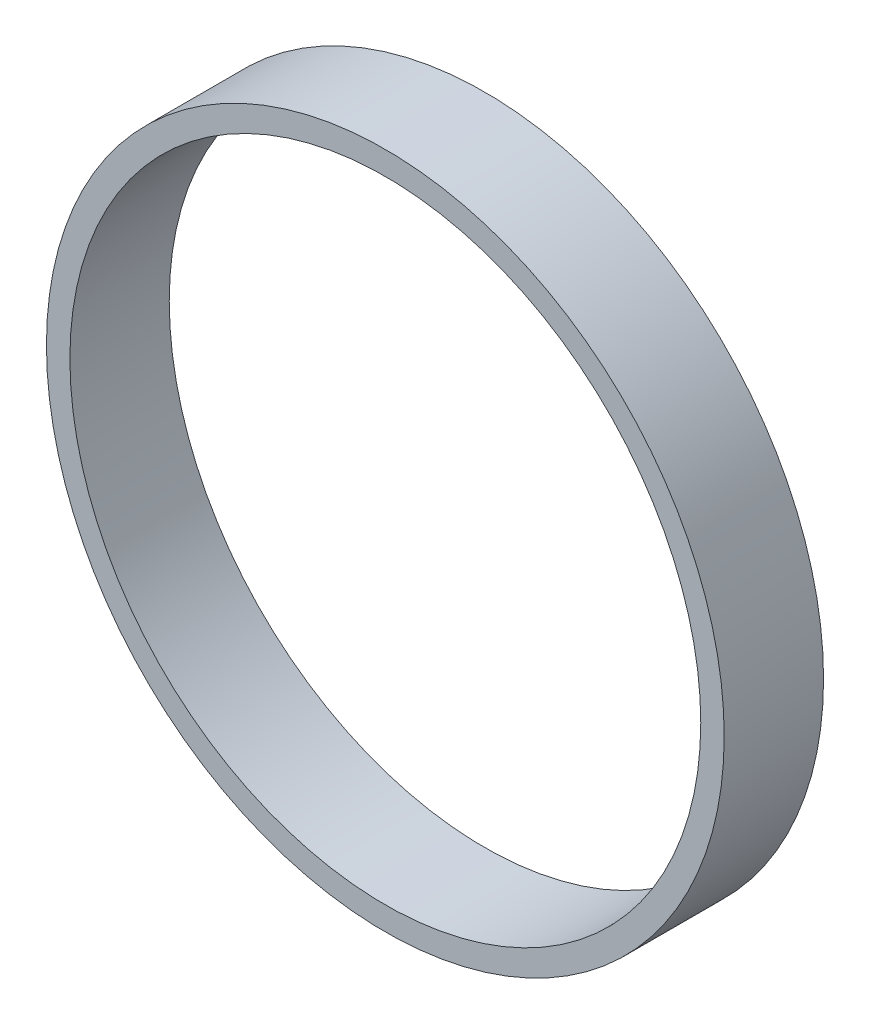
ISO-10303-21;
HEADER;
FILE_DESCRIPTION(('STEP AP214'),'2;1');
FILE_NAME('part.step','',(''),(''),'','','');
FILE_SCHEMA(('AUTOMOTIVE_DESIGN { 1 0 10303 214 1 1 1 1 }'));
ENDSEC;
DATA;
#1=APPLICATION_CONTEXT('core data for automotive mechanical design processes');
#2=APPLICATION_PROTOCOL_DEFINITION('international standard','automotive_design',2000,#1);
#3=PRODUCT_CONTEXT('',#1,'mechanical');
#4=PRODUCT('Part','Part','',(#3));
#5=PRODUCT_RELATED_PRODUCT_CATEGORY('part','',(#4));
#6=PRODUCT_DEFINITION_FORMATION('','',#4);
#7=PRODUCT_DEFINITION_CONTEXT('part definition',#1,'design');
#8=PRODUCT_DEFINITION('design','',#6,#7);
#9=PRODUCT_DEFINITION_SHAPE('','',#8);
#10=(LENGTH_UNIT() NAMED_UNIT(*) SI_UNIT(.MILLI.,.METRE.));
#11=(NAMED_UNIT(*) PLANE_ANGLE_UNIT() SI_UNIT($,.RADIAN.));
#12=(NAMED_UNIT(*) SI_UNIT($,.STERADIAN.) SOLID_ANGLE_UNIT());
#13=UNCERTAINTY_MEASURE_WITH_UNIT(LENGTH_MEASURE(1.E-05),#10,'distance_accuracy_value','');
#14=(GEOMETRIC_REPRESENTATION_CONTEXT(3) GLOBAL_UNCERTAINTY_ASSIGNED_CONTEXT((#13)) GLOBAL_UNIT_ASSIGNED_CONTEXT((#10,
#11,#12)) REPRESENTATION_CONTEXT('',''));
#15=CARTESIAN_POINT('',(0.,0.,0.));
#16=DIRECTION('',(0.,0.,1.));
#17=DIRECTION('',(1.,0.,0.));
#18=AXIS2_PLACEMENT_3D('',#15,#16,#17);
#19=CARTESIAN_POINT('',(0.,0.,10.));
#20=DIRECTION('',(0.,0.,1.));
#21=DIRECTION('',(1.,0.,0.));
#22=AXIS2_PLACEMENT_3D('',#19,#20,#21);
#23=PLANE('',#22);
#24=CARTESIAN_POINT('',(0.,0.,10.));
#25=DIRECTION('',(0.,0.,1.));
#26=DIRECTION('',(1.,0.,0.));
#27=AXIS2_PLACEMENT_3D('',#24,#25,#26);
#28=CIRCLE('',#27,34.11);
#29=CARTESIAN_POINT('',(34.11,0.,10.));
#30=VERTEX_POINT('',#29);
#31=EDGE_CURVE('E10',#30,#30,#28,.T.);
#32=ORIENTED_EDGE('',*,*,#31,.T.);
#33=EDGE_LOOP('',(#32));
#34=FACE_BOUND('',#33,.T.);
#35=CARTESIAN_POINT('',(0.,0.,10.));
#36=DIRECTION('',(0.,0.,1.));
#37=DIRECTION('',(1.,0.,0.));
#38=AXIS2_PLACEMENT_3D('',#35,#36,#37);
#39=CIRCLE('',#38,31.75);
#40=CARTESIAN_POINT('',(31.75,0.,10.));
#41=VERTEX_POINT('',#40);
#42=EDGE_CURVE('E46',#41,#41,#39,.T.);
#43=ORIENTED_EDGE('',*,*,#42,.F.);
#44=EDGE_LOOP('',(#43));
#45=FACE_BOUND('',#44,.T.);
#46=ADVANCED_FACE('F35',(#34,#45),#23,.T.);
#47=CARTESIAN_POINT('',(0.,0.,0.));
#48=DIRECTION('',(0.,0.,1.));
#49=DIRECTION('',(1.,0.,0.));
#50=AXIS2_PLACEMENT_3D('',#47,#48,#49);
#51=PLANE('',#50);
#52=CARTESIAN_POINT('',(0.,0.,0.));
#53=DIRECTION('',(0.,0.,1.));
#54=DIRECTION('',(1.,0.,0.));
#55=AXIS2_PLACEMENT_3D('',#52,#53,#54);
#56=CIRCLE('',#55,34.11);
#57=CARTESIAN_POINT('',(34.11,0.,0.));
#58=VERTEX_POINT('',#57);
#59=EDGE_CURVE('E39',#58,#58,#56,.T.);
#60=ORIENTED_EDGE('',*,*,#59,.F.);
#61=EDGE_LOOP('',(#60));
#62=FACE_BOUND('',#61,.T.);
#63=CARTESIAN_POINT('',(0.,0.,0.));
#64=DIRECTION('',(0.,0.,1.));
#65=DIRECTION('',(1.,0.,0.));
#66=AXIS2_PLACEMENT_3D('',#63,#64,#65);
#67=CIRCLE('',#66,31.75);
#68=CARTESIAN_POINT('',(31.75,0.,0.));
#69=VERTEX_POINT('',#68);
#70=EDGE_CURVE('E48',#69,#69,#67,.T.);
#71=ORIENTED_EDGE('',*,*,#70,.T.);
#72=EDGE_LOOP('',(#71));
#73=FACE_BOUND('',#72,.T.);
#74=ADVANCED_FACE('F58',(#62,#73),#51,.F.);
#75=CARTESIAN_POINT('',(0.,0.,10.));
#76=DIRECTION('',(0.,0.,-1.));
#77=DIRECTION('',(-1.,0.,0.));
#78=AXIS2_PLACEMENT_3D('',#75,#76,#77);
#79=CYLINDRICAL_SURFACE('',#78,34.11);
#80=ORIENTED_EDGE('',*,*,#31,.F.);
#81=EDGE_LOOP('',(#80));
#82=FACE_BOUND('',#81,.T.);
#83=ORIENTED_EDGE('',*,*,#59,.T.);
#84=EDGE_LOOP('',(#83));
#85=FACE_BOUND('',#84,.T.);
#86=ADVANCED_FACE('F37',(#82,#85),#79,.T.);
#87=CARTESIAN_POINT('',(0.,0.,10.));
#88=DIRECTION('',(0.,0.,-1.));
#89=DIRECTION('',(-1.,0.,0.));
#90=AXIS2_PLACEMENT_3D('',#87,#88,#89);
#91=CYLINDRICAL_SURFACE('',#90,31.75);
#92=ORIENTED_EDGE('',*,*,#42,.T.);
#93=EDGE_LOOP('',(#92));
#94=FACE_BOUND('',#93,.T.);
#95=ORIENTED_EDGE('',*,*,#70,.F.);
#96=EDGE_LOOP('',(#95));
#97=FACE_BOUND('',#96,.T.);
#98=ADVANCED_FACE('F54',(#94,#97),#91,.F.);
#99=CLOSED_SHELL('',(#46,#74,#86,#98));
#100=MANIFOLD_SOLID_BREP('B2',#99);
#101=ADVANCED_BREP_SHAPE_REPRESENTATION('',(#18,#100),#14);
#102=SHAPE_DEFINITION_REPRESENTATION(#9,#101);
ENDSEC;
END-ISO-10303-21;
